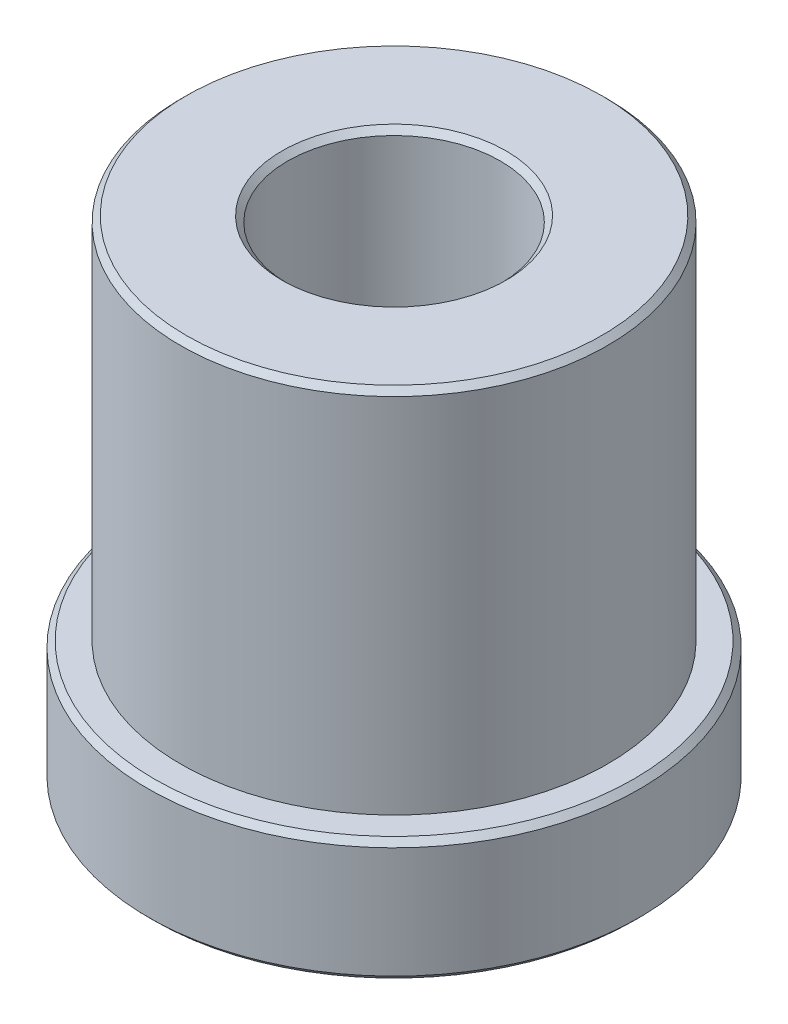
ISO-10303-21;
HEADER;
FILE_DESCRIPTION(('STEP AP214'),'2;1');
FILE_NAME('part.step','',(''),(''),'','','');
FILE_SCHEMA(('AUTOMOTIVE_DESIGN { 1 0 10303 214 1 1 1 1 }'));
ENDSEC;
DATA;
#1=APPLICATION_CONTEXT('core data for automotive mechanical design processes');
#2=APPLICATION_PROTOCOL_DEFINITION('international standard','automotive_design',2000,#1);
#3=PRODUCT_CONTEXT('',#1,'mechanical');
#4=PRODUCT('Part','Part','',(#3));
#5=PRODUCT_RELATED_PRODUCT_CATEGORY('part','',(#4));
#6=PRODUCT_DEFINITION_FORMATION('','',#4);
#7=PRODUCT_DEFINITION_CONTEXT('part definition',#1,'design');
#8=PRODUCT_DEFINITION('design','',#6,#7);
#9=PRODUCT_DEFINITION_SHAPE('','',#8);
#10=(LENGTH_UNIT() NAMED_UNIT(*) SI_UNIT(.MILLI.,.METRE.));
#11=(NAMED_UNIT(*) PLANE_ANGLE_UNIT() SI_UNIT($,.RADIAN.));
#12=(NAMED_UNIT(*) SI_UNIT($,.STERADIAN.) SOLID_ANGLE_UNIT());
#13=UNCERTAINTY_MEASURE_WITH_UNIT(LENGTH_MEASURE(1.E-05),#10,'distance_accuracy_value','');
#14=(GEOMETRIC_REPRESENTATION_CONTEXT(3) GLOBAL_UNCERTAINTY_ASSIGNED_CONTEXT((#13)) GLOBAL_UNIT_ASSIGNED_CONTEXT((#10,
#11,#12)) REPRESENTATION_CONTEXT('',''));
#15=CARTESIAN_POINT('',(0.,0.,0.));
#16=DIRECTION('',(0.,0.,1.));
#17=DIRECTION('',(1.,0.,0.));
#18=AXIS2_PLACEMENT_3D('',#15,#16,#17);
#19=CARTESIAN_POINT('',(0.,19.05,0.));
#20=DIRECTION('',(0.,-1.,0.));
#21=DIRECTION('',(0.,0.,-1.));
#22=AXIS2_PLACEMENT_3D('',#19,#20,#21);
#23=CYLINDRICAL_SURFACE('',#22,5.5);
#24=CARTESIAN_POINT('',(0.,-0.512800091999999,0.));
#25=DIRECTION('',(0.,-1.,0.));
#26=DIRECTION('',(0.,0.,-1.));
#27=AXIS2_PLACEMENT_3D('',#24,#25,#26);
#28=CIRCLE('',#27,5.5);
#29=CARTESIAN_POINT('',(0.,-0.512800091999999,-5.5));
#30=VERTEX_POINT('',#29);
#31=EDGE_CURVE('E73',#30,#30,#28,.T.);
#32=ORIENTED_EDGE('',*,*,#31,.T.);
#33=EDGE_LOOP('',(#32));
#34=FACE_BOUND('',#33,.T.);
#35=CARTESIAN_POINT('',(0.,18.750000092,0.));
#36=DIRECTION('',(0.,1.,0.));
#37=DIRECTION('',(0.,0.,1.));
#38=AXIS2_PLACEMENT_3D('',#35,#36,#37);
#39=CIRCLE('',#38,5.5);
#40=CARTESIAN_POINT('',(0.,18.750000092,5.5));
#41=VERTEX_POINT('',#40);
#42=EDGE_CURVE('E76',#41,#41,#39,.T.);
#43=ORIENTED_EDGE('',*,*,#42,.T.);
#44=EDGE_LOOP('',(#43));
#45=FACE_BOUND('',#44,.T.);
#46=ADVANCED_FACE('F37',(#34,#45),#23,.F.);
#47=CARTESIAN_POINT('',(0.,19.05,0.));
#48=DIRECTION('',(0.,-1.,0.));
#49=DIRECTION('',(0.,0.,-1.));
#50=AXIS2_PLACEMENT_3D('',#47,#48,#49);
#51=CYLINDRICAL_SURFACE('',#50,11.049);
#52=CARTESIAN_POINT('',(0.,18.750000092,0.));
#53=DIRECTION('',(0.,1.,0.));
#54=DIRECTION('',(0.,0.,1.));
#55=AXIS2_PLACEMENT_3D('',#52,#53,#54);
#56=CIRCLE('',#55,11.049);
#57=CARTESIAN_POINT('',(0.,18.750000092,-11.049));
#58=VERTEX_POINT('',#57);
#59=EDGE_CURVE('E10',#58,#58,#56,.F.);
#60=CARTESIAN_POINT('',(0.,0.,0.));
#61=DIRECTION('',(0.,1.,0.));
#62=DIRECTION('',(0.,0.,1.));
#63=AXIS2_PLACEMENT_3D('',#60,#61,#62);
#64=CIRCLE('',#63,11.049);
#65=CARTESIAN_POINT('',(0.,0.,-11.049));
#66=VERTEX_POINT('',#65);
#67=EDGE_CURVE('E82',#66,#66,#64,.T.);
#68=CARTESIAN_POINT('',(0.,18.750000092,-11.049));
#69=CARTESIAN_POINT('',(0.,18.5546875910417,-11.049));
#70=CARTESIAN_POINT('',(0.,18.3593750900834,-11.049));
#71=CARTESIAN_POINT('',(0.,17.9687500881667,-11.049));
#72=CARTESIAN_POINT('',(0.,17.7734375872084,-11.049));
#73=CARTESIAN_POINT('',(0.,17.3828125852917,-11.049));
#74=CARTESIAN_POINT('',(0.,17.1875000843334,-11.049));
#75=CARTESIAN_POINT('',(0.,16.7968750824167,-11.049));
#76=CARTESIAN_POINT('',(0.,16.6015625814584,-11.049));
#77=CARTESIAN_POINT('',(0.,16.2109375795417,-11.049));
#78=CARTESIAN_POINT('',(0.,16.0156250785834,-11.049));
#79=CARTESIAN_POINT('',(0.,15.6250000766667,-11.049));
#80=CARTESIAN_POINT('',(0.,15.4296875757084,-11.049));
#81=CARTESIAN_POINT('',(0.,15.0390625737917,-11.049));
#82=CARTESIAN_POINT('',(0.,14.8437500728334,-11.049));
#83=CARTESIAN_POINT('',(0.,14.4531250709167,-11.049));
#84=CARTESIAN_POINT('',(0.,14.2578125699584,-11.049));
#85=CARTESIAN_POINT('',(0.,13.8671875680417,-11.049));
#86=CARTESIAN_POINT('',(0.,13.6718750670834,-11.049));
#87=CARTESIAN_POINT('',(0.,13.2812500651667,-11.049));
#88=CARTESIAN_POINT('',(0.,13.0859375642084,-11.049));
#89=CARTESIAN_POINT('',(0.,12.6953125622917,-11.049));
#90=CARTESIAN_POINT('',(0.,12.5000000613334,-11.049));
#91=CARTESIAN_POINT('',(0.,12.1093750594167,-11.049));
#92=CARTESIAN_POINT('',(0.,11.9140625584584,-11.049));
#93=CARTESIAN_POINT('',(0.,11.5234375565417,-11.049));
#94=CARTESIAN_POINT('',(0.,11.3281250555833,-11.049));
#95=CARTESIAN_POINT('',(0.,10.9375000536667,-11.049));
#96=CARTESIAN_POINT('',(0.,10.7421875527083,-11.049));
#97=CARTESIAN_POINT('',(0.,10.3515625507917,-11.049));
#98=CARTESIAN_POINT('',(0.,10.1562500498333,-11.049));
#99=CARTESIAN_POINT('',(0.,9.76562504791668,-11.049));
#100=CARTESIAN_POINT('',(0.,9.57031254695835,-11.049));
#101=CARTESIAN_POINT('',(0.,9.17968754504168,-11.049));
#102=CARTESIAN_POINT('',(0.,8.98437504408335,-11.049));
#103=CARTESIAN_POINT('',(0.,8.59375004216668,-11.049));
#104=CARTESIAN_POINT('',(0.,8.39843754120835,-11.049));
#105=CARTESIAN_POINT('',(0.,8.00781253929168,-11.049));
#106=CARTESIAN_POINT('',(0.,7.81250003833335,-11.049));
#107=CARTESIAN_POINT('',(0.,7.42187503641668,-11.049));
#108=CARTESIAN_POINT('',(0.,7.22656253545834,-11.049));
#109=CARTESIAN_POINT('',(0.,6.83593753354168,-11.049));
#110=CARTESIAN_POINT('',(0.,6.64062503258334,-11.049));
#111=CARTESIAN_POINT('',(0.,6.25000003066668,-11.049));
#112=CARTESIAN_POINT('',(0.,6.05468752970834,-11.049));
#113=CARTESIAN_POINT('',(0.,5.66406252779167,-11.049));
#114=CARTESIAN_POINT('',(0.,5.46875002683334,-11.049));
#115=CARTESIAN_POINT('',(0.,5.07812502491667,-11.049));
#116=CARTESIAN_POINT('',(0.,4.88281252395834,-11.049));
#117=CARTESIAN_POINT('',(0.,4.49218752204167,-11.049));
#118=CARTESIAN_POINT('',(0.,4.29687502108334,-11.049));
#119=CARTESIAN_POINT('',(0.,3.90625001916667,-11.049));
#120=CARTESIAN_POINT('',(0.,3.71093751820834,-11.049));
#121=CARTESIAN_POINT('',(0.,3.32031251629167,-11.049));
#122=CARTESIAN_POINT('',(0.,3.12500001533334,-11.049));
#123=CARTESIAN_POINT('',(0.,2.73437501341667,-11.049));
#124=CARTESIAN_POINT('',(0.,2.53906251245834,-11.049));
#125=CARTESIAN_POINT('',(0.,2.14843751054167,-11.049));
#126=CARTESIAN_POINT('',(0.,1.95312500958334,-11.049));
#127=CARTESIAN_POINT('',(0.,1.56250000766667,-11.049));
#128=CARTESIAN_POINT('',(0.,1.36718750670833,-11.049));
#129=CARTESIAN_POINT('',(0.,0.976562504791667,-11.049));
#130=CARTESIAN_POINT('',(0.,0.781250003833334,-11.049));
#131=CARTESIAN_POINT('',(0.,0.390625001916667,-11.049));
#132=CARTESIAN_POINT('',(0.,0.195312500958333,-11.049));
#133=CARTESIAN_POINT('',(0.,0.,-11.049));
#134=B_SPLINE_CURVE_WITH_KNOTS('',3,(#68,#69,#70,#71,#72,#73,#74,#75,#76,#77,#78,#79,#80,#81,
#82,#83,#84,#85,#86,#87,#88,#89,#90,#91,#92,#93,#94,#95,#96,#97,#98,#99,#100,#101,#102,#103,
#104,#105,#106,#107,#108,#109,#110,#111,#112,#113,#114,#115,#116,#117,#118,#119,#120,#121,#122,
#123,#124,#125,#126,#127,#128,#129,#130,#131,#132,#133),.UNSPECIFIED.,.F.,.F.,(4,2,2,2,2,2,2,2,
2,2,2,2,2,2,2,2,2,2,2,2,2,2,2,2,2,2,2,2,2,2,2,2,4),(0.,0.585937502875,1.17187500575,
1.757812508625,2.3437500115,2.929687514375,3.51562501725,4.101562520125,4.68750002300001,
5.27343752587501,5.85937502875001,6.44531253162501,7.03125003450001,7.61718753737501,
8.20312504025001,8.78906254312501,9.37500004600001,9.96093754887501,10.54687505175,
11.132812554625,11.7187500575,12.304687560375,12.89062506325,13.476562566125,14.062500069,
14.648437571875,15.23437507475,15.820312577625,16.4062500805,16.992187583375,17.57812508625,
18.164062589125,18.750000092),.UNSPECIFIED.);
#135=EDGE_CURVE('BSEAM108',#58,#66,#134,.T.);
#136=ORIENTED_EDGE('',*,*,#59,.T.);
#137=ORIENTED_EDGE('',*,*,#67,.T.);
#138=ORIENTED_EDGE('',*,*,#135,.T.);
#139=ORIENTED_EDGE('',*,*,#135,.F.);
#140=EDGE_LOOP('',(#136,#138,#137,#139));
#141=FACE_BOUND('',#140,.T.);
#142=ADVANCED_FACE('F108',(#141),#51,.T.);
#143=CARTESIAN_POINT('',(0.,19.05,0.));
#144=DIRECTION('',(0.,1.,0.));
#145=DIRECTION('',(0.,0.,1.));
#146=AXIS2_PLACEMENT_3D('',#143,#144,#145);
#147=PLANE('',#146);
#148=CARTESIAN_POINT('',(0.,19.05,0.));
#149=DIRECTION('',(0.,1.,0.));
#150=DIRECTION('',(0.,0.,1.));
#151=AXIS2_PLACEMENT_3D('',#148,#149,#150);
#152=CIRCLE('',#151,10.749000092);
#153=CARTESIAN_POINT('',(0.,19.05,10.749000092));
#154=VERTEX_POINT('',#153);
#155=EDGE_CURVE('E45',#154,#154,#152,.T.);
#156=ORIENTED_EDGE('',*,*,#155,.T.);
#157=EDGE_LOOP('',(#156));
#158=FACE_BOUND('',#157,.T.);
#159=CARTESIAN_POINT('',(0.,19.05,0.));
#160=DIRECTION('',(0.,1.,0.));
#161=DIRECTION('',(0.,0.,1.));
#162=AXIS2_PLACEMENT_3D('',#159,#160,#161);
#163=CIRCLE('',#162,5.79999990800001);
#164=CARTESIAN_POINT('',(0.,19.05,5.799999908));
#165=VERTEX_POINT('',#164);
#166=EDGE_CURVE('E49',#165,#165,#163,.F.);
#167=ORIENTED_EDGE('',*,*,#166,.T.);
#168=EDGE_LOOP('',(#167));
#169=FACE_BOUND('',#168,.T.);
#170=ADVANCED_FACE('F113',(#158,#169),#147,.T.);
#171=CARTESIAN_POINT('',(0.,-6.35,0.));
#172=DIRECTION('',(0.,1.,0.));
#173=DIRECTION('',(0.,0.,1.));
#174=AXIS2_PLACEMENT_3D('',#171,#172,#173);
#175=CYLINDRICAL_SURFACE('',#174,12.7);
#176=CARTESIAN_POINT('',(0.,-0.299999908,0.));
#177=DIRECTION('',(0.,-1.,0.));
#178=DIRECTION('',(0.,0.,-1.));
#179=AXIS2_PLACEMENT_3D('',#176,#177,#178);
#180=CIRCLE('',#179,12.7);
#181=CARTESIAN_POINT('',(0.,-0.299999908,-12.7));
#182=VERTEX_POINT('',#181);
#183=EDGE_CURVE('E67',#182,#182,#180,.T.);
#184=ORIENTED_EDGE('',*,*,#183,.T.);
#185=EDGE_LOOP('',(#184));
#186=FACE_BOUND('',#185,.T.);
#187=CARTESIAN_POINT('',(0.,-6.05000009199999,0.));
#188=DIRECTION('',(0.,-1.,0.));
#189=DIRECTION('',(0.,0.,-1.));
#190=AXIS2_PLACEMENT_3D('',#187,#188,#189);
#191=CIRCLE('',#190,12.7);
#192=CARTESIAN_POINT('',(0.,-6.05000009199999,-12.7));
#193=VERTEX_POINT('',#192);
#194=EDGE_CURVE('E70',#193,#193,#191,.F.);
#195=ORIENTED_EDGE('',*,*,#194,.T.);
#196=EDGE_LOOP('',(#195));
#197=FACE_BOUND('',#196,.T.);
#198=ADVANCED_FACE('F120',(#186,#197),#175,.T.);
#199=CARTESIAN_POINT('',(0.,-6.35,0.));
#200=DIRECTION('',(0.,-1.,0.));
#201=DIRECTION('',(0.,0.,-1.));
#202=AXIS2_PLACEMENT_3D('',#199,#200,#201);
#203=PLANE('',#202);
#204=CARTESIAN_POINT('',(0.,-6.35,0.));
#205=DIRECTION('',(0.,-1.,0.));
#206=DIRECTION('',(0.,0.,-1.));
#207=AXIS2_PLACEMENT_3D('',#204,#205,#206);
#208=CIRCLE('',#207,12.400000092);
#209=CARTESIAN_POINT('',(0.,-6.35,-12.400000092));
#210=VERTEX_POINT('',#209);
#211=EDGE_CURVE('E58',#210,#210,#208,.T.);
#212=ORIENTED_EDGE('',*,*,#211,.T.);
#213=EDGE_LOOP('',(#212));
#214=FACE_BOUND('',#213,.T.);
#215=CARTESIAN_POINT('',(0.,-6.35,0.));
#216=DIRECTION('',(0.,-1.,0.));
#217=DIRECTION('',(0.,0.,-1.));
#218=AXIS2_PLACEMENT_3D('',#215,#216,#217);
#219=CIRCLE('',#218,11.412499908);
#220=CARTESIAN_POINT('',(0.,-6.35,-11.412499908));
#221=VERTEX_POINT('',#220);
#222=EDGE_CURVE('E61',#221,#221,#219,.F.);
#223=ORIENTED_EDGE('',*,*,#222,.T.);
#224=EDGE_LOOP('',(#223));
#225=FACE_BOUND('',#224,.T.);
#226=ADVANCED_FACE('F117',(#214,#225),#203,.T.);
#227=CARTESIAN_POINT('',(0.,0.,0.));
#228=DIRECTION('',(0.,-1.,0.));
#229=DIRECTION('',(0.,0.,-1.));
#230=AXIS2_PLACEMENT_3D('',#227,#228,#229);
#231=PLANE('',#230);
#232=CARTESIAN_POINT('',(0.,0.,0.));
#233=DIRECTION('',(0.,-1.,0.));
#234=DIRECTION('',(0.,0.,-1.));
#235=AXIS2_PLACEMENT_3D('',#232,#233,#234);
#236=CIRCLE('',#235,12.400000092);
#237=CARTESIAN_POINT('',(0.,0.,-12.400000092));
#238=VERTEX_POINT('',#237);
#239=EDGE_CURVE('E64',#238,#238,#236,.F.);
#240=ORIENTED_EDGE('',*,*,#239,.T.);
#241=EDGE_LOOP('',(#240));
#242=FACE_BOUND('',#241,.T.);
#243=ORIENTED_EDGE('',*,*,#67,.F.);
#244=EDGE_LOOP('',(#243));
#245=FACE_BOUND('',#244,.T.);
#246=ADVANCED_FACE('F103',(#242,#245),#231,.F.);
#247=CARTESIAN_POINT('',(0.,-0.8128,0.));
#248=DIRECTION('',(0.,-1.,0.));
#249=DIRECTION('',(0.,0.,-1.));
#250=AXIS2_PLACEMENT_3D('',#247,#248,#249);
#251=PLANE('',#250);
#252=CARTESIAN_POINT('',(0.,-0.8128,0.));
#253=DIRECTION('',(0.,-1.,0.));
#254=DIRECTION('',(0.,0.,-1.));
#255=AXIS2_PLACEMENT_3D('',#252,#253,#254);
#256=CIRCLE('',#255,5.799999908);
#257=CARTESIAN_POINT('',(0.,-0.8128,-5.799999908));
#258=VERTEX_POINT('',#257);
#259=EDGE_CURVE('E79',#258,#258,#256,.F.);
#260=ORIENTED_EDGE('',*,*,#259,.T.);
#261=EDGE_LOOP('',(#260));
#262=FACE_BOUND('',#261,.T.);
#263=CARTESIAN_POINT('',(0.,-0.8128,0.));
#264=DIRECTION('',(0.,-1.,0.));
#265=DIRECTION('',(0.,0.,-1.));
#266=AXIS2_PLACEMENT_3D('',#263,#264,#265);
#267=CIRCLE('',#266,11.1125);
#268=CARTESIAN_POINT('',(0.,-0.8128,-11.1125));
#269=VERTEX_POINT('',#268);
#270=EDGE_CURVE('E85',#269,#269,#267,.T.);
#271=ORIENTED_EDGE('',*,*,#270,.T.);
#272=EDGE_LOOP('',(#271));
#273=FACE_BOUND('',#272,.T.);
#274=ADVANCED_FACE('F89',(#262,#273),#251,.T.);
#275=CARTESIAN_POINT('',(0.,-0.8128,0.));
#276=DIRECTION('',(0.,-1.,0.));
#277=DIRECTION('',(0.,0.,-1.));
#278=AXIS2_PLACEMENT_3D('',#275,#276,#277);
#279=CYLINDRICAL_SURFACE('',#278,11.1125);
#280=CARTESIAN_POINT('',(0.,-6.050000092,0.));
#281=DIRECTION('',(0.,-1.,0.));
#282=DIRECTION('',(0.,0.,-1.));
#283=AXIS2_PLACEMENT_3D('',#280,#281,#282);
#284=CIRCLE('',#283,11.1125);
#285=CARTESIAN_POINT('',(0.,-6.050000092,-11.1125));
#286=VERTEX_POINT('',#285);
#287=EDGE_CURVE('E53',#286,#286,#284,.T.);
#288=ORIENTED_EDGE('',*,*,#287,.T.);
#289=EDGE_LOOP('',(#288));
#290=FACE_BOUND('',#289,.T.);
#291=ORIENTED_EDGE('',*,*,#270,.F.);
#292=EDGE_LOOP('',(#291));
#293=FACE_BOUND('',#292,.T.);
#294=ADVANCED_FACE('F91',(#290,#293),#279,.F.);
#295=CARTESIAN_POINT('',(0.,-0.812799999999999,0.));
#296=DIRECTION('',(0.,-1.,0.));
#297=DIRECTION('',(0.,0.,-1.));
#298=AXIS2_PLACEMENT_3D('',#295,#296,#297);
#299=CONICAL_SURFACE('',#298,5.799999908,0.785398163397445);
#300=ORIENTED_EDGE('',*,*,#31,.F.);
#301=EDGE_LOOP('',(#300));
#302=FACE_BOUND('',#301,.T.);
#303=ORIENTED_EDGE('',*,*,#259,.F.);
#304=EDGE_LOOP('',(#303));
#305=FACE_BOUND('',#304,.T.);
#306=ADVANCED_FACE('F93',(#302,#305),#299,.F.);
#307=CARTESIAN_POINT('',(0.,-0.299999908,0.));
#308=DIRECTION('',(0.,-1.,0.));
#309=DIRECTION('',(0.,0.,-1.));
#310=AXIS2_PLACEMENT_3D('',#307,#308,#309);
#311=CONICAL_SURFACE('',#310,12.7,0.785398163397445);
#312=ORIENTED_EDGE('',*,*,#239,.F.);
#313=EDGE_LOOP('',(#312));
#314=FACE_BOUND('',#313,.T.);
#315=ORIENTED_EDGE('',*,*,#183,.F.);
#316=EDGE_LOOP('',(#315));
#317=FACE_BOUND('',#316,.T.);
#318=ADVANCED_FACE('F100',(#314,#317),#311,.T.);
#319=CARTESIAN_POINT('',(0.,-6.35,0.));
#320=DIRECTION('',(0.,1.,0.));
#321=DIRECTION('',(0.,0.,1.));
#322=AXIS2_PLACEMENT_3D('',#319,#320,#321);
#323=CONICAL_SURFACE('',#322,12.400000092,0.785398163397451);
#324=ORIENTED_EDGE('',*,*,#194,.F.);
#325=EDGE_LOOP('',(#324));
#326=FACE_BOUND('',#325,.T.);
#327=ORIENTED_EDGE('',*,*,#211,.F.);
#328=EDGE_LOOP('',(#327));
#329=FACE_BOUND('',#328,.T.);
#330=ADVANCED_FACE('F139',(#326,#329),#323,.T.);
#331=CARTESIAN_POINT('',(0.,-6.050000092,0.));
#332=DIRECTION('',(0.,-1.,0.));
#333=DIRECTION('',(0.,0.,-1.));
#334=AXIS2_PLACEMENT_3D('',#331,#332,#333);
#335=CONICAL_SURFACE('',#334,11.1125,0.785398163397448);
#336=ORIENTED_EDGE('',*,*,#222,.F.);
#337=EDGE_LOOP('',(#336));
#338=FACE_BOUND('',#337,.T.);
#339=ORIENTED_EDGE('',*,*,#287,.F.);
#340=EDGE_LOOP('',(#339));
#341=FACE_BOUND('',#340,.T.);
#342=ADVANCED_FACE('F146',(#338,#341),#335,.F.);
#343=CARTESIAN_POINT('',(0.,19.05,0.));
#344=DIRECTION('',(0.,-1.,0.));
#345=DIRECTION('',(0.,0.,-1.));
#346=AXIS2_PLACEMENT_3D('',#343,#344,#345);
#347=CONICAL_SURFACE('',#346,10.749000092,0.785398163397437);
#348=ORIENTED_EDGE('',*,*,#59,.F.);
#349=EDGE_LOOP('',(#348));
#350=FACE_BOUND('',#349,.T.);
#351=ORIENTED_EDGE('',*,*,#155,.F.);
#352=EDGE_LOOP('',(#351));
#353=FACE_BOUND('',#352,.T.);
#354=ADVANCED_FACE('F152',(#350,#353),#347,.T.);
#355=CARTESIAN_POINT('',(0.,19.05,0.));
#356=DIRECTION('',(0.,1.,0.));
#357=DIRECTION('',(0.,0.,1.));
#358=AXIS2_PLACEMENT_3D('',#355,#356,#357);
#359=CONICAL_SURFACE('',#358,5.79999990800001,0.785398163397446);
#360=CARTESIAN_POINT('',(0.,18.750000092,5.5));
#361=CARTESIAN_POINT('',(0.,18.7531250910417,5.50312499904166));
#362=CARTESIAN_POINT('',(0.,18.7562500900833,5.50624999808333));
#363=CARTESIAN_POINT('',(0.,18.7625000881667,5.51249999616666));
#364=CARTESIAN_POINT('',(0.,18.7656250872083,5.51562499520833));
#365=CARTESIAN_POINT('',(0.,18.7718750852917,5.52187499329166));
#366=CARTESIAN_POINT('',(0.,18.7750000843333,5.52499999233333));
#367=CARTESIAN_POINT('',(0.,18.7812500824167,5.53124999041666));
#368=CARTESIAN_POINT('',(0.,18.7843750814583,5.53437498945833));
#369=CARTESIAN_POINT('',(0.,18.7906250795417,5.54062498754166));
#370=CARTESIAN_POINT('',(0.,18.7937500785833,5.54374998658333));
#371=CARTESIAN_POINT('',(0.,18.8000000766667,5.54999998466667));
#372=CARTESIAN_POINT('',(0.,18.8031250757083,5.55312498370833));
#373=CARTESIAN_POINT('',(0.,18.8093750737917,5.55937498179166));
#374=CARTESIAN_POINT('',(0.,18.8125000728333,5.56249998083333));
#375=CARTESIAN_POINT('',(0.,18.8187500709167,5.56874997891667));
#376=CARTESIAN_POINT('',(0.,18.8218750699583,5.57187497795833));
#377=CARTESIAN_POINT('',(0.,18.8281250680417,5.57812497604167));
#378=CARTESIAN_POINT('',(0.,18.8312500670833,5.58124997508333));
#379=CARTESIAN_POINT('',(0.,18.8375000651667,5.58749997316667));
#380=CARTESIAN_POINT('',(0.,18.8406250642083,5.59062497220833));
#381=CARTESIAN_POINT('',(0.,18.8468750622917,5.59687497029167));
#382=CARTESIAN_POINT('',(0.,18.8500000613333,5.59999996933333));
#383=CARTESIAN_POINT('',(0.,18.8562500594167,5.60624996741667));
#384=CARTESIAN_POINT('',(0.,18.8593750584583,5.60937496645833));
#385=CARTESIAN_POINT('',(0.,18.8656250565417,5.61562496454167));
#386=CARTESIAN_POINT('',(0.,18.8687500555833,5.61874996358333));
#387=CARTESIAN_POINT('',(0.,18.8750000536667,5.62499996166667));
#388=CARTESIAN_POINT('',(0.,18.8781250527083,5.62812496070833));
#389=CARTESIAN_POINT('',(0.,18.8843750507917,5.63437495879167));
#390=CARTESIAN_POINT('',(0.,18.8875000498333,5.63749995783333));
#391=CARTESIAN_POINT('',(0.,18.8937500479167,5.64374995591667));
#392=CARTESIAN_POINT('',(0.,18.8968750469583,5.64687495495833));
#393=CARTESIAN_POINT('',(0.,18.9031250450417,5.65312495304167));
#394=CARTESIAN_POINT('',(0.,18.9062500440833,5.65624995208333));
#395=CARTESIAN_POINT('',(0.,18.9125000421667,5.66249995016667));
#396=CARTESIAN_POINT('',(0.,18.9156250412083,5.66562494920833));
#397=CARTESIAN_POINT('',(0.,18.9218750392917,5.67187494729167));
#398=CARTESIAN_POINT('',(0.,18.9250000383333,5.67499994633333));
#399=CARTESIAN_POINT('',(0.,18.9312500364167,5.68124994441667));
#400=CARTESIAN_POINT('',(0.,18.9343750354583,5.68437494345833));
#401=CARTESIAN_POINT('',(0.,18.9406250335417,5.69062494154167));
#402=CARTESIAN_POINT('',(0.,18.9437500325833,5.69374994058334));
#403=CARTESIAN_POINT('',(0.,18.9500000306667,5.69999993866667));
#404=CARTESIAN_POINT('',(0.,18.9531250297083,5.70312493770833));
#405=CARTESIAN_POINT('',(0.,18.9593750277917,5.70937493579167));
#406=CARTESIAN_POINT('',(0.,18.9625000268333,5.71249993483334));
#407=CARTESIAN_POINT('',(0.,18.9687500249167,5.71874993291667));
#408=CARTESIAN_POINT('',(0.,18.9718750239583,5.72187493195834));
#409=CARTESIAN_POINT('',(0.,18.9781250220417,5.72812493004167));
#410=CARTESIAN_POINT('',(0.,18.9812500210833,5.73124992908334));
#411=CARTESIAN_POINT('',(0.,18.9875000191667,5.73749992716667));
#412=CARTESIAN_POINT('',(0.,18.9906250182083,5.74062492620834));
#413=CARTESIAN_POINT('',(0.,18.9968750162917,5.74687492429167));
#414=CARTESIAN_POINT('',(0.,19.0000000153333,5.74999992333334));
#415=CARTESIAN_POINT('',(0.,19.0062500134167,5.75624992141667));
#416=CARTESIAN_POINT('',(0.,19.0093750124583,5.75937492045834));
#417=CARTESIAN_POINT('',(0.,19.0156250105417,5.76562491854167));
#418=CARTESIAN_POINT('',(0.,19.0187500095833,5.76874991758334));
#419=CARTESIAN_POINT('',(0.,19.0250000076667,5.77499991566667));
#420=CARTESIAN_POINT('',(0.,19.0281250067083,5.77812491470834));
#421=CARTESIAN_POINT('',(0.,19.0343750047917,5.78437491279167));
#422=CARTESIAN_POINT('',(0.,19.0375000038333,5.78749991183334));
#423=CARTESIAN_POINT('',(0.,19.0437500019167,5.79374990991667));
#424=CARTESIAN_POINT('',(0.,19.0468750009583,5.79687490895834));
#425=CARTESIAN_POINT('',(0.,19.05,5.799999908));
#426=B_SPLINE_CURVE_WITH_KNOTS('',3,(#360,#361,#362,#363,#364,#365,#366,#367,#368,#369,#370,
#371,#372,#373,#374,#375,#376,#377,#378,#379,#380,#381,#382,#383,#384,#385,#386,#387,#388,#389,
#390,#391,#392,#393,#394,#395,#396,#397,#398,#399,#400,#401,#402,#403,#404,#405,#406,#407,#408,
#409,#410,#411,#412,#413,#414,#415,#416,#417,#418,#419,#420,#421,#422,#423,#424,#425),
.UNSPECIFIED.,.F.,.F.,(4,2,2,2,2,2,2,2,2,2,2,2,2,2,2,2,2,2,2,2,2,2,2,2,2,2,2,2,2,2,2,2,4),(0.,
0.0132582480813864,0.0265164961627703,0.0397747442441543,0.0530329923255382,0.0662912404069222,
0.0795494884883061,0.09280773656969,0.106065984651074,0.119324232732458,0.132582480813842,
0.145840728895226,0.15909897697661,0.172357225057994,0.185615473139378,0.198873721220762,
0.212131969302146,0.22539021738353,0.238648465464914,0.251906713546298,0.265164961627682,
0.278423209709066,0.29168145779045,0.304939705871834,0.318197953953217,0.331456202034602,
0.344714450115986,0.35797269819737,0.371230946278754,0.384489194360138,0.397747442441522,
0.411005690522906,0.424263938604292),.UNSPECIFIED.);
#427=EDGE_CURVE('BSEAM40',#41,#165,#426,.T.);
#428=ORIENTED_EDGE('',*,*,#42,.F.);
#429=ORIENTED_EDGE('',*,*,#166,.F.);
#430=ORIENTED_EDGE('',*,*,#427,.T.);
#431=ORIENTED_EDGE('',*,*,#427,.F.);
#432=EDGE_LOOP('',(#428,#430,#429,#431));
#433=FACE_BOUND('',#432,.T.);
#434=ADVANCED_FACE('F40',(#433),#359,.F.);
#435=CLOSED_SHELL('',(#46,#142,#170,#198,#226,#246,#274,#294,#306,#318,#330,#342,#354,#434));
#436=MANIFOLD_SOLID_BREP('B2',#435);
#437=ADVANCED_BREP_SHAPE_REPRESENTATION('',(#18,#436),#14);
#438=SHAPE_DEFINITION_REPRESENTATION(#9,#437);
ENDSEC;
END-ISO-10303-21;
